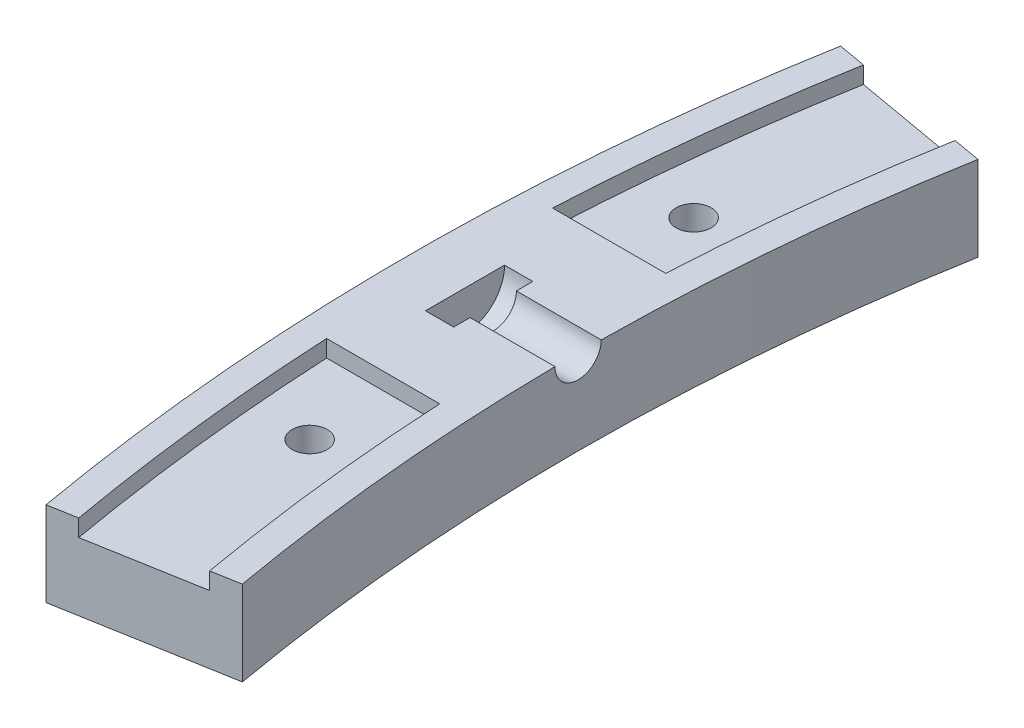
ISO-10303-21;
HEADER;
FILE_DESCRIPTION(('STEP AP214'),'2;1');
FILE_NAME('part.step','',(''),(''),'','','');
FILE_SCHEMA(('AUTOMOTIVE_DESIGN { 1 0 10303 214 1 1 1 1 }'));
ENDSEC;
DATA;
#1=APPLICATION_CONTEXT('core data for automotive mechanical design processes');
#2=APPLICATION_PROTOCOL_DEFINITION('international standard','automotive_design',2000,#1);
#3=PRODUCT_CONTEXT('',#1,'mechanical');
#4=PRODUCT('Part','Part','',(#3));
#5=PRODUCT_RELATED_PRODUCT_CATEGORY('part','',(#4));
#6=PRODUCT_DEFINITION_FORMATION('','',#4);
#7=PRODUCT_DEFINITION_CONTEXT('part definition',#1,'design');
#8=PRODUCT_DEFINITION('design','',#6,#7);
#9=PRODUCT_DEFINITION_SHAPE('','',#8);
#10=(LENGTH_UNIT() NAMED_UNIT(*) SI_UNIT(.MILLI.,.METRE.));
#11=(NAMED_UNIT(*) PLANE_ANGLE_UNIT() SI_UNIT($,.RADIAN.));
#12=(NAMED_UNIT(*) SI_UNIT($,.STERADIAN.) SOLID_ANGLE_UNIT());
#13=UNCERTAINTY_MEASURE_WITH_UNIT(LENGTH_MEASURE(1.E-05),#10,'distance_accuracy_value','');
#14=(GEOMETRIC_REPRESENTATION_CONTEXT(3) GLOBAL_UNCERTAINTY_ASSIGNED_CONTEXT((#13)) GLOBAL_UNIT_ASSIGNED_CONTEXT((#10,
#11,#12)) REPRESENTATION_CONTEXT('',''));
#15=CARTESIAN_POINT('',(0.,0.,0.));
#16=DIRECTION('',(0.,0.,1.));
#17=DIRECTION('',(1.,0.,0.));
#18=AXIS2_PLACEMENT_3D('',#15,#16,#17);
#19=CARTESIAN_POINT('',(0.,7.50000000000011,0.));
#20=DIRECTION('',(0.,1.00000000000001,0.));
#21=DIRECTION('',(0.,0.,1.00000000000005));
#22=AXIS2_PLACEMENT_3D('',#19,#20,#21);
#23=PLANE('',#22);
#24=DIRECTION('',(0.,0.,-1.00000000000005));
#25=VECTOR('',#24,1.);
#26=CARTESIAN_POINT('',(-195.000000000009,7.50000000000011,0.));
#27=LINE('',#26,#25);
#28=CARTESIAN_POINT('',(-195.000000000009,7.50000000000011,-2.05000000000012));
#29=VERTEX_POINT('',#28);
#30=CARTESIAN_POINT('',(-195.000000000009,7.50000000000011,-3.50000000000022));
#31=VERTEX_POINT('',#30);
#32=EDGE_CURVE('E160',#29,#31,#27,.T.);
#33=ORIENTED_EDGE('',*,*,#32,.F.);
#34=DIRECTION('',(-1.00000000000004,0.,0.));
#35=VECTOR('',#34,1.);
#36=CARTESIAN_POINT('',(-184.651453689793,7.50000000000011,-2.05000000000012));
#37=LINE('',#36,#35);
#38=CARTESIAN_POINT('',(-187.488792998413,7.50000000000011,-2.05000000000012));
#39=VERTEX_POINT('',#38);
#40=EDGE_CURVE('E48',#29,#39,#37,.F.);
#41=ORIENTED_EDGE('',*,*,#40,.T.);
#42=CARTESIAN_POINT('',(0.,7.50000000000011,0.));
#43=DIRECTION('',(0.,-1.00000000000001,0.));
#44=DIRECTION('',(0.,0.,1.00000000000005));
#45=AXIS2_PLACEMENT_3D('',#42,#43,#44);
#46=CIRCLE('',#45,187.5);
#47=CARTESIAN_POINT('',(-184.651453689793,7.50000000000011,-32.559033312551));
#48=VERTEX_POINT('',#47);
#49=EDGE_CURVE('E248',#39,#48,#46,.T.);
#50=ORIENTED_EDGE('',*,*,#49,.T.);
#51=DIRECTION('',(-0.984807753012244,0.,-0.173648177666936));
#52=VECTOR('',#51,1.);
#53=CARTESIAN_POINT('',(-199.423569984981,7.50000000000011,-35.1637559775549));
#54=LINE('',#53,#52);
#55=CARTESIAN_POINT('',(-187.113473072324,7.50000000000011,-32.9931537567183));
#56=VERTEX_POINT('',#55);
#57=EDGE_CURVE('E251',#48,#56,#54,.T.);
#58=ORIENTED_EDGE('',*,*,#57,.T.);
#59=CARTESIAN_POINT('',(0.,7.50000000000011,0.));
#60=DIRECTION('',(0.,1.00000000000001,0.));
#61=DIRECTION('',(0.,0.,1.00000000000005));
#62=AXIS2_PLACEMENT_3D('',#59,#60,#61);
#63=CIRCLE('',#62,190.);
#64=CARTESIAN_POINT('',(-189.736659610112,7.50000000000011,-10.0000000000003));
#65=VERTEX_POINT('',#64);
#66=EDGE_CURVE('E198',#56,#65,#63,.T.);
#67=ORIENTED_EDGE('',*,*,#66,.T.);
#68=DIRECTION('',(-1.00000000000004,0.,0.));
#69=VECTOR('',#68,1.);
#70=CARTESIAN_POINT('',(0.,7.50000000000011,-10.0000000000003));
#71=LINE('',#70,#69);
#72=CARTESIAN_POINT('',(-199.749843554391,7.50000000000011,-10.0000000000003));
#73=VERTEX_POINT('',#72);
#74=EDGE_CURVE('E189',#65,#73,#71,.T.);
#75=ORIENTED_EDGE('',*,*,#74,.T.);
#76=CARTESIAN_POINT('',(0.,7.50000000000011,0.));
#77=DIRECTION('',(0.,1.00000000000001,0.));
#78=DIRECTION('',(0.,0.,1.00000000000005));
#79=AXIS2_PLACEMENT_3D('',#76,#77,#78);
#80=CIRCLE('',#79,200.);
#81=CARTESIAN_POINT('',(-196.961550602451,7.50000000000011,-34.7296355333876));
#82=VERTEX_POINT('',#81);
#83=EDGE_CURVE('E201',#82,#73,#80,.T.);
#84=ORIENTED_EDGE('',*,*,#83,.F.);
#85=CARTESIAN_POINT('',(-199.423569984981,7.50000000000011,-35.1637559775549));
#86=VERTEX_POINT('',#85);
#87=EDGE_CURVE('E250',#82,#86,#54,.T.);
#88=ORIENTED_EDGE('',*,*,#87,.T.);
#89=CARTESIAN_POINT('',(0.,7.50000000000011,0.));
#90=DIRECTION('',(0.,1.00000000000001,0.));
#91=DIRECTION('',(0.,0.,1.00000000000005));
#92=AXIS2_PLACEMENT_3D('',#89,#90,#91);
#93=CIRCLE('',#92,202.5);
#94=CARTESIAN_POINT('',(-199.423569984981,7.50000000000011,35.163755977555));
#95=VERTEX_POINT('',#94);
#96=EDGE_CURVE('E240',#86,#95,#93,.T.);
#97=ORIENTED_EDGE('',*,*,#96,.T.);
#98=DIRECTION('',(0.984807753012244,0.,-0.173648177666936));
#99=VECTOR('',#98,1.);
#100=CARTESIAN_POINT('',(-184.651453689793,7.50000000000011,32.559033312551));
#101=LINE('',#100,#99);
#102=CARTESIAN_POINT('',(-196.961550602451,7.50000000000011,34.7296355333876));
#103=VERTEX_POINT('',#102);
#104=EDGE_CURVE('E245',#95,#103,#101,.T.);
#105=ORIENTED_EDGE('',*,*,#104,.T.);
#106=CARTESIAN_POINT('',(0.,7.50000000000011,0.));
#107=DIRECTION('',(0.,1.00000000000001,0.));
#108=DIRECTION('',(0.,0.,1.00000000000005));
#109=AXIS2_PLACEMENT_3D('',#106,#107,#108);
#110=CIRCLE('',#109,200.);
#111=CARTESIAN_POINT('',(-199.749843554391,7.50000000000011,10.0000000000004));
#112=VERTEX_POINT('',#111);
#113=EDGE_CURVE('E220',#112,#103,#110,.T.);
#114=ORIENTED_EDGE('',*,*,#113,.F.);
#115=DIRECTION('',(1.00000000000004,0.,0.));
#116=VECTOR('',#115,1.);
#117=CARTESIAN_POINT('',(0.,7.50000000000011,10.0000000000004));
#118=LINE('',#117,#116);
#119=CARTESIAN_POINT('',(-189.736659610112,7.50000000000011,10.0000000000004));
#120=VERTEX_POINT('',#119);
#121=EDGE_CURVE('E180',#112,#120,#118,.T.);
#122=ORIENTED_EDGE('',*,*,#121,.T.);
#123=CARTESIAN_POINT('',(0.,7.50000000000011,0.));
#124=DIRECTION('',(0.,1.00000000000001,0.));
#125=DIRECTION('',(0.,0.,1.00000000000005));
#126=AXIS2_PLACEMENT_3D('',#123,#124,#125);
#127=CIRCLE('',#126,190.);
#128=CARTESIAN_POINT('',(-187.113473072324,7.50000000000011,32.9931537567183));
#129=VERTEX_POINT('',#128);
#130=EDGE_CURVE('E177',#120,#129,#127,.T.);
#131=ORIENTED_EDGE('',*,*,#130,.T.);
#132=CARTESIAN_POINT('',(-184.651453689793,7.50000000000011,32.5590333125509));
#133=VERTEX_POINT('',#132);
#134=EDGE_CURVE('E243',#129,#133,#101,.T.);
#135=ORIENTED_EDGE('',*,*,#134,.T.);
#136=CARTESIAN_POINT('',(-187.488792998413,7.50000000000011,2.05000000000007));
#137=VERTEX_POINT('',#136);
#138=EDGE_CURVE('E155',#133,#137,#46,.T.);
#139=ORIENTED_EDGE('',*,*,#138,.T.);
#140=DIRECTION('',(-1.00000000000004,0.,0.));
#141=VECTOR('',#140,1.);
#142=CARTESIAN_POINT('',(-184.651453689793,7.50000000000011,2.05000000000007));
#143=LINE('',#142,#141);
#144=CARTESIAN_POINT('',(-195.000000000009,7.50000000000011,2.05000000000007));
#145=VERTEX_POINT('',#144);
#146=EDGE_CURVE('E146',#137,#145,#143,.T.);
#147=ORIENTED_EDGE('',*,*,#146,.T.);
#148=CARTESIAN_POINT('',(-195.000000000009,7.50000000000011,3.50000000000017));
#149=VERTEX_POINT('',#148);
#150=EDGE_CURVE('E153',#149,#145,#27,.T.);
#151=ORIENTED_EDGE('',*,*,#150,.F.);
#152=DIRECTION('',(1.00000000000004,0.,0.));
#153=VECTOR('',#152,1.);
#154=CARTESIAN_POINT('',(-197.500000000009,7.50000000000011,3.50000000000017));
#155=LINE('',#154,#153);
#156=CARTESIAN_POINT('',(-197.500000000009,7.50000000000011,3.50000000000017));
#157=VERTEX_POINT('',#156);
#158=EDGE_CURVE('E162',#157,#149,#155,.T.);
#159=ORIENTED_EDGE('',*,*,#158,.F.);
#160=DIRECTION('',(0.,0.,-1.00000000000005));
#161=VECTOR('',#160,1.);
#162=CARTESIAN_POINT('',(-197.500000000009,7.50000000000011,0.));
#163=LINE('',#162,#161);
#164=CARTESIAN_POINT('',(-197.500000000009,7.50000000000011,-3.50000000000022));
#165=VERTEX_POINT('',#164);
#166=EDGE_CURVE('E42',#157,#165,#163,.T.);
#167=ORIENTED_EDGE('',*,*,#166,.T.);
#168=DIRECTION('',(1.00000000000004,0.,0.));
#169=VECTOR('',#168,1.);
#170=CARTESIAN_POINT('',(-197.500000000009,7.50000000000011,-3.50000000000022));
#171=LINE('',#170,#169);
#172=EDGE_CURVE('E159',#31,#165,#171,.F.);
#173=ORIENTED_EDGE('',*,*,#172,.F.);
#174=EDGE_LOOP('',(#33,#41,#50,#58,#67,#75,#84,#88,#97,#105,#114,#122,#131,#135,#139,#147,#151,
#159,#167,#173));
#175=FACE_BOUND('',#174,.T.);
#176=ADVANCED_FACE('F34',(#175),#23,.T.);
#177=CARTESIAN_POINT('',(0.,7.50000000000011,0.));
#178=DIRECTION('',(0.,-1.00000000000001,0.));
#179=DIRECTION('',(0.,0.,-1.00000000000005));
#180=AXIS2_PLACEMENT_3D('',#177,#178,#179);
#181=CYLINDRICAL_SURFACE('',#180,187.5);
#182=CARTESIAN_POINT('',(-187.488792998413,7.50000000000011,2.05000000000007));
#183=CARTESIAN_POINT('',(-187.488792849281,7.44232711308553,2.04999961912121));
#184=CARTESIAN_POINT('',(-187.488819643224,7.38468185889424,2.0475646966342));
#185=CARTESIAN_POINT('',(-187.488925536575,7.26980385815491,2.03785081221489));
#186=CARTESIAN_POINT('',(-187.489004633468,7.2125710918987,2.03057208328557));
#187=CARTESIAN_POINT('',(-187.489317677698,7.04220079957593,2.00153837830414));
#188=CARTESIAN_POINT('',(-187.48962738847,6.93020459038204,1.97258569878913));
#189=CARTESIAN_POINT('',(-187.490414473226,6.71266806517123,1.89629080362172));
#190=CARTESIAN_POINT('',(-187.490891924796,6.60713076320279,1.84894007712929));
#191=CARTESIAN_POINT('',(-187.491960485973,6.40550870317435,1.73719964588891));
#192=CARTESIAN_POINT('',(-187.492551573346,6.30942210149567,1.67281327349101));
#193=CARTESIAN_POINT('',(-187.493780888756,6.12941929865537,1.52882171925991));
#194=CARTESIAN_POINT('',(-187.494419119586,6.04550381930664,1.44921563546462));
#195=CARTESIAN_POINT('',(-187.495670842949,5.89221433312215,1.27703268155445));
#196=CARTESIAN_POINT('',(-187.4962843317,5.82284254272342,1.18445383799145));
#197=CARTESIAN_POINT('',(-187.497417285369,5.70062866199897,0.988964560660456));
#198=CARTESIAN_POINT('',(-187.497936752081,5.647786256115,0.886054324176002));
#199=CARTESIAN_POINT('',(-187.498823077717,5.5601321464015,0.672828980658536));
#200=CARTESIAN_POINT('',(-187.49918994644,5.52531928471737,0.562514349648704));
#201=CARTESIAN_POINT('',(-187.499729758185,5.47470826179882,0.337608070566619));
#202=CARTESIAN_POINT('',(-187.499902705095,5.45890971928417,0.223016508304045));
#203=CARTESIAN_POINT('',(-187.500035189832,5.44677456272366,-0.00719528273405206));
#204=CARTESIAN_POINT('',(-187.499994722813,5.45043839059384,-0.122815534807681));
#205=CARTESIAN_POINT('',(-187.499704938695,5.47712422933031,-0.351793552120607));
#206=CARTESIAN_POINT('',(-187.4994556326,5.50014522032995,-0.465151436234678));
#207=CARTESIAN_POINT('',(-187.498776290712,5.56489028065436,-0.686392914402732));
#208=CARTESIAN_POINT('',(-187.498346255467,5.60661429331914,-0.794276525039689));
#209=CARTESIAN_POINT('',(-187.497353907621,5.70758310800407,-1.00151277318807));
#210=CARTESIAN_POINT('',(-187.496791588681,5.7668287497668,-1.10086500152945));
#211=CARTESIAN_POINT('',(-187.495598106194,5.90115548445373,-1.2882082364995));
#212=CARTESIAN_POINT('',(-187.494966946011,5.97623580382809,-1.37619979777689));
#213=CARTESIAN_POINT('',(-187.493706954425,6.14009403418969,-1.53832355892678));
#214=CARTESIAN_POINT('',(-187.493078122837,6.22887082269646,-1.61245689343629));
#215=CARTESIAN_POINT('',(-187.491893425822,6.41764509266345,-1.74479088744738));
#216=CARTESIAN_POINT('',(-187.491337583642,6.51764613007164,-1.80298647752054));
#217=CARTESIAN_POINT('',(-187.490361477193,6.72604223808001,-1.90179009729814));
#218=CARTESIAN_POINT('',(-187.489941295683,6.8344423826509,-1.94238739653085));
#219=CARTESIAN_POINT('',(-187.489284996913,7.05643589799864,-2.00474436125492));
#220=CARTESIAN_POINT('',(-187.489048598591,7.17002105647758,-2.02653279700965));
#221=CARTESIAN_POINT('',(-187.488875643458,7.32030107272998,-2.04242845263005));
#222=CARTESIAN_POINT('',(-187.488844667317,7.35621372009782,-2.04526928209854));
#223=CARTESIAN_POINT('',(-187.488803372466,7.42807939690246,-2.04905246362838));
#224=CARTESIAN_POINT('',(-187.488793019685,7.4640322613972,-2.04999794685185));
#225=CARTESIAN_POINT('',(-187.488792998413,7.50000000000011,-2.05000000000012));
#226=B_SPLINE_CURVE_WITH_KNOTS('',3,(#182,#183,#184,#185,#186,#187,#188,#189,#190,#191,#192,
#193,#194,#195,#196,#197,#198,#199,#200,#201,#202,#203,#204,#205,#206,#207,#208,#209,#210,#211,
#212,#213,#214,#215,#216,#217,#218,#219,#220,#221,#222,#223,#224,#225),.UNSPECIFIED.,.F.,.F.,(4,
2,2,2,2,2,2,2,2,2,2,2,2,2,2,2,2,2,2,2,2,4),(0.,0.172912382791425,0.345816448531269,
0.6910716400783,1.03648673538197,1.38183431377899,1.72720236477407,2.0726230111579,
2.41803706280208,2.76342892925654,3.10881386970529,3.45420665255967,3.79958123891978,
4.14495477898958,4.49034487413383,4.83571810031493,5.18106303679866,5.52651769228723,
5.87218269178337,6.21731801628906,6.32535769525366,6.4332187422346),.UNSPECIFIED.);
#227=EDGE_CURVE('E156',#137,#39,#226,.T.);
#228=ORIENTED_EDGE('',*,*,#227,.F.);
#229=ORIENTED_EDGE('',*,*,#138,.F.);
#230=DIRECTION('',(0.,-1.00000000000001,0.));
#231=VECTOR('',#230,1.);
#232=CARTESIAN_POINT('',(-184.651453689793,7.50000000000011,32.5590333125509));
#233=LINE('',#232,#231);
#234=CARTESIAN_POINT('',(-184.651453689793,0.,32.5590333125509));
#235=VERTEX_POINT('',#234);
#236=EDGE_CURVE('E266',#133,#235,#233,.T.);
#237=ORIENTED_EDGE('',*,*,#236,.T.);
#238=CARTESIAN_POINT('',(0.,0.,0.));
#239=DIRECTION('',(0.,-1.00000000000001,0.));
#240=DIRECTION('',(0.,0.,1.00000000000005));
#241=AXIS2_PLACEMENT_3D('',#238,#239,#240);
#242=CIRCLE('',#241,187.5);
#243=CARTESIAN_POINT('',(-184.651453689793,0.,-32.559033312551));
#244=VERTEX_POINT('',#243);
#245=EDGE_CURVE('E259',#235,#244,#242,.T.);
#246=ORIENTED_EDGE('',*,*,#245,.T.);
#247=DIRECTION('',(0.,-1.00000000000001,0.));
#248=VECTOR('',#247,1.);
#249=CARTESIAN_POINT('',(-184.651453689793,7.50000000000011,-32.559033312551));
#250=LINE('',#249,#248);
#251=EDGE_CURVE('E264',#48,#244,#250,.T.);
#252=ORIENTED_EDGE('',*,*,#251,.F.);
#253=ORIENTED_EDGE('',*,*,#49,.F.);
#254=EDGE_LOOP('',(#228,#229,#237,#246,#252,#253));
#255=FACE_BOUND('',#254,.T.);
#256=ADVANCED_FACE('F284',(#255),#181,.F.);
#257=CARTESIAN_POINT('',(-184.651453689793,7.50000000000011,32.559033312551));
#258=DIRECTION('',(-0.173648177666934,0.,-0.984807753012258));
#259=DIRECTION('',(-0.984807753012244,0.,0.173648177666936));
#260=AXIS2_PLACEMENT_3D('',#257,#258,#259);
#261=PLANE('',#260);
#262=DIRECTION('',(0.,1.00000000000001,0.));
#263=VECTOR('',#262,1.);
#264=CARTESIAN_POINT('',(-187.113473072324,6.00000000000011,32.9931537567183));
#265=LINE('',#264,#263);
#266=CARTESIAN_POINT('',(-187.113473072324,6.00000000000011,32.9931537567183));
#267=VERTEX_POINT('',#266);
#268=EDGE_CURVE('E202',#267,#129,#265,.T.);
#269=ORIENTED_EDGE('',*,*,#268,.F.);
#270=DIRECTION('',(0.984807753012244,0.,-0.173648177666936));
#271=VECTOR('',#270,1.);
#272=CARTESIAN_POINT('',(0.,6.00000000000011,0.));
#273=LINE('',#272,#271);
#274=CARTESIAN_POINT('',(-196.961550602451,6.00000000000011,34.7296355333876));
#275=VERTEX_POINT('',#274);
#276=EDGE_CURVE('E225',#275,#267,#273,.T.);
#277=ORIENTED_EDGE('',*,*,#276,.F.);
#278=DIRECTION('',(0.,1.00000000000001,0.));
#279=VECTOR('',#278,1.);
#280=CARTESIAN_POINT('',(-196.961550602451,6.00000000000011,34.7296355333876));
#281=LINE('',#280,#279);
#282=EDGE_CURVE('E233',#275,#103,#281,.T.);
#283=ORIENTED_EDGE('',*,*,#282,.T.);
#284=ORIENTED_EDGE('',*,*,#104,.F.);
#285=DIRECTION('',(0.,-1.00000000000001,0.));
#286=VECTOR('',#285,1.);
#287=CARTESIAN_POINT('',(-199.423569984981,7.50000000000011,35.163755977555));
#288=LINE('',#287,#286);
#289=CARTESIAN_POINT('',(-199.423569984981,0.,35.163755977555));
#290=VERTEX_POINT('',#289);
#291=EDGE_CURVE('E164',#95,#290,#288,.T.);
#292=ORIENTED_EDGE('',*,*,#291,.T.);
#293=DIRECTION('',(0.984807753012244,0.,-0.173648177666936));
#294=VECTOR('',#293,1.);
#295=CARTESIAN_POINT('',(-184.651453689793,0.,32.559033312551));
#296=LINE('',#295,#294);
#297=EDGE_CURVE('E257',#290,#235,#296,.T.);
#298=ORIENTED_EDGE('',*,*,#297,.T.);
#299=ORIENTED_EDGE('',*,*,#236,.F.);
#300=ORIENTED_EDGE('',*,*,#134,.F.);
#301=EDGE_LOOP('',(#269,#277,#283,#284,#292,#298,#299,#300));
#302=FACE_BOUND('',#301,.T.);
#303=ADVANCED_FACE('F275',(#302),#261,.F.);
#304=CARTESIAN_POINT('',(-199.423569984981,7.50000000000011,-35.1637559775549));
#305=DIRECTION('',(-0.173648177666934,0.,0.984807753012258));
#306=DIRECTION('',(0.984807753012244,0.,0.173648177666936));
#307=AXIS2_PLACEMENT_3D('',#304,#305,#306);
#308=PLANE('',#307);
#309=DIRECTION('',(0.,1.00000000000001,0.));
#310=VECTOR('',#309,1.);
#311=CARTESIAN_POINT('',(-187.113473072324,6.00000000000011,-32.9931537567183));
#312=LINE('',#311,#310);
#313=CARTESIAN_POINT('',(-187.113473072324,6.00000000000011,-32.9931537567183));
#314=VERTEX_POINT('',#313);
#315=EDGE_CURVE('E197',#314,#56,#312,.T.);
#316=ORIENTED_EDGE('',*,*,#315,.T.);
#317=ORIENTED_EDGE('',*,*,#57,.F.);
#318=ORIENTED_EDGE('',*,*,#251,.T.);
#319=DIRECTION('',(-0.984807753012244,0.,-0.173648177666936));
#320=VECTOR('',#319,1.);
#321=CARTESIAN_POINT('',(-199.423569984981,0.,-35.1637559775549));
#322=LINE('',#321,#320);
#323=CARTESIAN_POINT('',(-199.423569984981,0.,-35.1637559775549));
#324=VERTEX_POINT('',#323);
#325=EDGE_CURVE('E244',#244,#324,#322,.T.);
#326=ORIENTED_EDGE('',*,*,#325,.T.);
#327=DIRECTION('',(0.,-1.00000000000001,0.));
#328=VECTOR('',#327,1.);
#329=CARTESIAN_POINT('',(-199.423569984981,7.50000000000011,-35.1637559775549));
#330=LINE('',#329,#328);
#331=EDGE_CURVE('E254',#86,#324,#330,.T.);
#332=ORIENTED_EDGE('',*,*,#331,.F.);
#333=ORIENTED_EDGE('',*,*,#87,.F.);
#334=DIRECTION('',(0.,1.00000000000001,0.));
#335=VECTOR('',#334,1.);
#336=CARTESIAN_POINT('',(-196.961550602451,6.00000000000011,-34.7296355333876));
#337=LINE('',#336,#335);
#338=CARTESIAN_POINT('',(-196.961550602451,6.00000000000011,-34.7296355333876));
#339=VERTEX_POINT('',#338);
#340=EDGE_CURVE('E213',#339,#82,#337,.T.);
#341=ORIENTED_EDGE('',*,*,#340,.F.);
#342=DIRECTION('',(-0.984807753012244,0.,-0.173648177666936));
#343=VECTOR('',#342,1.);
#344=CARTESIAN_POINT('',(0.,6.00000000000011,0.));
#345=LINE('',#344,#343);
#346=EDGE_CURVE('E188',#314,#339,#345,.T.);
#347=ORIENTED_EDGE('',*,*,#346,.F.);
#348=EDGE_LOOP('',(#316,#317,#318,#326,#332,#333,#341,#347));
#349=FACE_BOUND('',#348,.T.);
#350=ADVANCED_FACE('F288',(#349),#308,.F.);
#351=CARTESIAN_POINT('',(0.,7.50000000000011,0.));
#352=DIRECTION('',(0.,-1.00000000000001,0.));
#353=DIRECTION('',(0.,0.,-1.00000000000005));
#354=AXIS2_PLACEMENT_3D('',#351,#352,#353);
#355=CYLINDRICAL_SURFACE('',#354,202.5);
#356=CARTESIAN_POINT('',(0.,0.,0.));
#357=DIRECTION('',(0.,1.00000000000001,0.));
#358=DIRECTION('',(0.,0.,1.00000000000005));
#359=AXIS2_PLACEMENT_3D('',#356,#357,#358);
#360=CIRCLE('',#359,202.5);
#361=EDGE_CURVE('E210',#324,#290,#360,.T.);
#362=ORIENTED_EDGE('',*,*,#361,.T.);
#363=ORIENTED_EDGE('',*,*,#291,.F.);
#364=ORIENTED_EDGE('',*,*,#96,.F.);
#365=ORIENTED_EDGE('',*,*,#331,.T.);
#366=EDGE_LOOP('',(#362,#363,#364,#365));
#367=FACE_BOUND('',#366,.T.);
#368=ADVANCED_FACE('F36',(#367),#355,.T.);
#369=CARTESIAN_POINT('',(0.,0.,0.));
#370=DIRECTION('',(0.,1.00000000000001,0.));
#371=DIRECTION('',(0.,0.,1.00000000000005));
#372=AXIS2_PLACEMENT_3D('',#369,#370,#371);
#373=PLANE('',#372);
#374=CARTESIAN_POINT('',(-194.257966127898,0.,16.995369835794));
#375=DIRECTION('',(0.,-1.00000000000001,0.));
#376=DIRECTION('',(0.,0.,-1.00000000000004));
#377=AXIS2_PLACEMENT_3D('',#374,#375,#376);
#378=CIRCLE('',#377,1.55);
#379=CARTESIAN_POINT('',(-194.257966127898,0.,15.445369835794));
#380=VERTEX_POINT('',#379);
#381=EDGE_CURVE('E487',#380,#380,#378,.T.);
#382=ORIENTED_EDGE('',*,*,#381,.F.);
#383=EDGE_LOOP('',(#382));
#384=FACE_BOUND('',#383,.T.);
#385=CARTESIAN_POINT('',(-194.257966127898,0.,-16.995369835794));
#386=DIRECTION('',(0.,-1.00000000000001,0.));
#387=DIRECTION('',(0.,0.,-1.00000000000004));
#388=AXIS2_PLACEMENT_3D('',#385,#386,#387);
#389=CIRCLE('',#388,1.55);
#390=CARTESIAN_POINT('',(-194.257966127898,0.,-18.5453698357941));
#391=VERTEX_POINT('',#390);
#392=EDGE_CURVE('E293',#391,#391,#389,.T.);
#393=ORIENTED_EDGE('',*,*,#392,.F.);
#394=EDGE_LOOP('',(#393));
#395=FACE_BOUND('',#394,.T.);
#396=ORIENTED_EDGE('',*,*,#361,.F.);
#397=ORIENTED_EDGE('',*,*,#325,.F.);
#398=ORIENTED_EDGE('',*,*,#245,.F.);
#399=ORIENTED_EDGE('',*,*,#297,.F.);
#400=EDGE_LOOP('',(#396,#397,#398,#399));
#401=FACE_BOUND('',#400,.T.);
#402=ADVANCED_FACE('F282',(#384,#395,#401),#373,.F.);
#403=CARTESIAN_POINT('',(0.,6.00000000000011,0.));
#404=DIRECTION('',(0.,1.00000000000001,0.));
#405=DIRECTION('',(0.,0.,1.00000000000005));
#406=AXIS2_PLACEMENT_3D('',#403,#404,#405);
#407=CYLINDRICAL_SURFACE('',#406,190.);
#408=ORIENTED_EDGE('',*,*,#130,.F.);
#409=DIRECTION('',(0.,1.00000000000001,0.));
#410=VECTOR('',#409,1.);
#411=CARTESIAN_POINT('',(-189.736659610112,6.00000000000011,10.0000000000004));
#412=LINE('',#411,#410);
#413=CARTESIAN_POINT('',(-189.736659610112,6.00000000000011,10.0000000000004));
#414=VERTEX_POINT('',#413);
#415=EDGE_CURVE('E227',#414,#120,#412,.T.);
#416=ORIENTED_EDGE('',*,*,#415,.F.);
#417=CARTESIAN_POINT('',(0.,6.00000000000011,0.));
#418=DIRECTION('',(0.,1.00000000000001,0.));
#419=DIRECTION('',(0.,0.,1.00000000000005));
#420=AXIS2_PLACEMENT_3D('',#417,#418,#419);
#421=CIRCLE('',#420,190.);
#422=EDGE_CURVE('E217',#414,#267,#421,.T.);
#423=ORIENTED_EDGE('',*,*,#422,.T.);
#424=ORIENTED_EDGE('',*,*,#268,.T.);
#425=EDGE_LOOP('',(#408,#416,#423,#424));
#426=FACE_BOUND('',#425,.T.);
#427=ADVANCED_FACE('F340',(#426),#407,.T.);
#428=CARTESIAN_POINT('',(0.,6.00000000000011,0.));
#429=DIRECTION('',(0.,1.00000000000001,0.));
#430=DIRECTION('',(0.,0.,1.00000000000005));
#431=AXIS2_PLACEMENT_3D('',#428,#429,#430);
#432=CYLINDRICAL_SURFACE('',#431,200.);
#433=ORIENTED_EDGE('',*,*,#113,.T.);
#434=ORIENTED_EDGE('',*,*,#282,.F.);
#435=CARTESIAN_POINT('',(0.,6.00000000000011,0.));
#436=DIRECTION('',(0.,1.00000000000001,0.));
#437=DIRECTION('',(0.,0.,1.00000000000005));
#438=AXIS2_PLACEMENT_3D('',#435,#436,#437);
#439=CIRCLE('',#438,200.);
#440=CARTESIAN_POINT('',(-199.749843554391,6.00000000000011,10.0000000000004));
#441=VERTEX_POINT('',#440);
#442=EDGE_CURVE('E222',#441,#275,#439,.T.);
#443=ORIENTED_EDGE('',*,*,#442,.F.);
#444=DIRECTION('',(0.,1.00000000000001,0.));
#445=VECTOR('',#444,1.);
#446=CARTESIAN_POINT('',(-199.749843554391,6.00000000000011,10.0000000000004));
#447=LINE('',#446,#445);
#448=EDGE_CURVE('E236',#441,#112,#447,.T.);
#449=ORIENTED_EDGE('',*,*,#448,.T.);
#450=EDGE_LOOP('',(#433,#434,#443,#449));
#451=FACE_BOUND('',#450,.T.);
#452=ADVANCED_FACE('F337',(#451),#432,.F.);
#453=CARTESIAN_POINT('',(0.,6.00000000000011,10.0000000000004));
#454=DIRECTION('',(0.,0.,1.00000000000005));
#455=DIRECTION('',(1.00000000000004,0.,0.));
#456=AXIS2_PLACEMENT_3D('',#453,#454,#455);
#457=PLANE('',#456);
#458=ORIENTED_EDGE('',*,*,#121,.F.);
#459=ORIENTED_EDGE('',*,*,#448,.F.);
#460=DIRECTION('',(1.00000000000004,0.,0.));
#461=VECTOR('',#460,1.);
#462=CARTESIAN_POINT('',(0.,6.00000000000011,10.0000000000004));
#463=LINE('',#462,#461);
#464=EDGE_CURVE('E219',#441,#414,#463,.T.);
#465=ORIENTED_EDGE('',*,*,#464,.T.);
#466=ORIENTED_EDGE('',*,*,#415,.T.);
#467=EDGE_LOOP('',(#458,#459,#465,#466));
#468=FACE_BOUND('',#467,.T.);
#469=ADVANCED_FACE('F335',(#468),#457,.T.);
#470=CARTESIAN_POINT('',(0.,6.00000000000011,0.));
#471=DIRECTION('',(0.,1.00000000000001,0.));
#472=DIRECTION('',(0.,0.,1.00000000000005));
#473=AXIS2_PLACEMENT_3D('',#470,#471,#472);
#474=PLANE('',#473);
#475=CARTESIAN_POINT('',(-194.257966127898,6.00000000000011,16.995369835794));
#476=DIRECTION('',(0.,1.00000000000001,0.));
#477=DIRECTION('',(0.,0.,1.00000000000004));
#478=AXIS2_PLACEMENT_3D('',#475,#476,#477);
#479=CIRCLE('',#478,1.55);
#480=CARTESIAN_POINT('',(-194.257966127898,6.00000000000011,18.5453698357941));
#481=VERTEX_POINT('',#480);
#482=EDGE_CURVE('E484',#481,#481,#479,.T.);
#483=ORIENTED_EDGE('',*,*,#482,.F.);
#484=EDGE_LOOP('',(#483));
#485=FACE_BOUND('',#484,.T.);
#486=ORIENTED_EDGE('',*,*,#422,.F.);
#487=ORIENTED_EDGE('',*,*,#464,.F.);
#488=ORIENTED_EDGE('',*,*,#442,.T.);
#489=ORIENTED_EDGE('',*,*,#276,.T.);
#490=EDGE_LOOP('',(#486,#487,#488,#489));
#491=FACE_BOUND('',#490,.T.);
#492=ADVANCED_FACE('F331',(#485,#491),#474,.T.);
#493=CARTESIAN_POINT('',(0.,6.00000000000011,0.));
#494=DIRECTION('',(0.,1.00000000000001,0.));
#495=DIRECTION('',(0.,0.,1.00000000000005));
#496=AXIS2_PLACEMENT_3D('',#493,#494,#495);
#497=CYLINDRICAL_SURFACE('',#496,190.);
#498=ORIENTED_EDGE('',*,*,#66,.F.);
#499=ORIENTED_EDGE('',*,*,#315,.F.);
#500=CARTESIAN_POINT('',(0.,6.00000000000011,0.));
#501=DIRECTION('',(0.,1.00000000000001,0.));
#502=DIRECTION('',(0.,0.,1.00000000000005));
#503=AXIS2_PLACEMENT_3D('',#500,#501,#502);
#504=CIRCLE('',#503,190.);
#505=CARTESIAN_POINT('',(-189.736659610112,6.00000000000011,-10.0000000000003));
#506=VERTEX_POINT('',#505);
#507=EDGE_CURVE('E185',#314,#506,#504,.T.);
#508=ORIENTED_EDGE('',*,*,#507,.T.);
#509=DIRECTION('',(0.,1.00000000000001,0.));
#510=VECTOR('',#509,1.);
#511=CARTESIAN_POINT('',(-189.736659610112,6.00000000000011,-10.0000000000003));
#512=LINE('',#511,#510);
#513=EDGE_CURVE('E207',#506,#65,#512,.T.);
#514=ORIENTED_EDGE('',*,*,#513,.T.);
#515=EDGE_LOOP('',(#498,#499,#508,#514));
#516=FACE_BOUND('',#515,.T.);
#517=ADVANCED_FACE('F324',(#516),#497,.T.);
#518=CARTESIAN_POINT('',(0.,6.00000000000011,-10.0000000000003));
#519=DIRECTION('',(0.,0.,-1.00000000000005));
#520=DIRECTION('',(-1.00000000000004,0.,0.));
#521=AXIS2_PLACEMENT_3D('',#518,#519,#520);
#522=PLANE('',#521);
#523=ORIENTED_EDGE('',*,*,#74,.F.);
#524=ORIENTED_EDGE('',*,*,#513,.F.);
#525=DIRECTION('',(-1.00000000000004,0.,0.));
#526=VECTOR('',#525,1.);
#527=CARTESIAN_POINT('',(0.,6.00000000000011,-10.0000000000003));
#528=LINE('',#527,#526);
#529=CARTESIAN_POINT('',(-199.749843554391,6.00000000000011,-10.0000000000003));
#530=VERTEX_POINT('',#529);
#531=EDGE_CURVE('E195',#506,#530,#528,.T.);
#532=ORIENTED_EDGE('',*,*,#531,.T.);
#533=DIRECTION('',(0.,1.00000000000001,0.));
#534=VECTOR('',#533,1.);
#535=CARTESIAN_POINT('',(-199.749843554391,6.00000000000011,-10.0000000000003));
#536=LINE('',#535,#534);
#537=EDGE_CURVE('E211',#530,#73,#536,.T.);
#538=ORIENTED_EDGE('',*,*,#537,.T.);
#539=EDGE_LOOP('',(#523,#524,#532,#538));
#540=FACE_BOUND('',#539,.T.);
#541=ADVANCED_FACE('F321',(#540),#522,.T.);
#542=CARTESIAN_POINT('',(0.,6.00000000000011,0.));
#543=DIRECTION('',(0.,1.00000000000001,0.));
#544=DIRECTION('',(0.,0.,1.00000000000005));
#545=AXIS2_PLACEMENT_3D('',#542,#543,#544);
#546=CYLINDRICAL_SURFACE('',#545,200.);
#547=ORIENTED_EDGE('',*,*,#83,.T.);
#548=ORIENTED_EDGE('',*,*,#537,.F.);
#549=CARTESIAN_POINT('',(0.,6.00000000000011,0.));
#550=DIRECTION('',(0.,1.00000000000001,0.));
#551=DIRECTION('',(0.,0.,1.00000000000005));
#552=AXIS2_PLACEMENT_3D('',#549,#550,#551);
#553=CIRCLE('',#552,200.);
#554=EDGE_CURVE('E192',#339,#530,#553,.T.);
#555=ORIENTED_EDGE('',*,*,#554,.F.);
#556=ORIENTED_EDGE('',*,*,#340,.T.);
#557=EDGE_LOOP('',(#547,#548,#555,#556));
#558=FACE_BOUND('',#557,.T.);
#559=ADVANCED_FACE('F319',(#558),#546,.F.);
#560=CARTESIAN_POINT('',(0.,6.00000000000011,0.));
#561=DIRECTION('',(0.,1.00000000000001,0.));
#562=DIRECTION('',(0.,0.,1.00000000000005));
#563=AXIS2_PLACEMENT_3D('',#560,#561,#562);
#564=PLANE('',#563);
#565=CARTESIAN_POINT('',(-194.257966127898,6.00000000000011,-16.995369835794));
#566=DIRECTION('',(0.,1.00000000000001,0.));
#567=DIRECTION('',(0.,0.,1.00000000000004));
#568=AXIS2_PLACEMENT_3D('',#565,#566,#567);
#569=CIRCLE('',#568,1.55);
#570=CARTESIAN_POINT('',(-194.257966127898,6.00000000000011,-15.445369835794));
#571=VERTEX_POINT('',#570);
#572=EDGE_CURVE('E290',#571,#571,#569,.T.);
#573=ORIENTED_EDGE('',*,*,#572,.F.);
#574=EDGE_LOOP('',(#573));
#575=FACE_BOUND('',#574,.T.);
#576=ORIENTED_EDGE('',*,*,#507,.F.);
#577=ORIENTED_EDGE('',*,*,#346,.T.);
#578=ORIENTED_EDGE('',*,*,#554,.T.);
#579=ORIENTED_EDGE('',*,*,#531,.F.);
#580=EDGE_LOOP('',(#576,#577,#578,#579));
#581=FACE_BOUND('',#580,.T.);
#582=ADVANCED_FACE('F316',(#575,#581),#564,.T.);
#583=CARTESIAN_POINT('',(-197.500000000009,7.50000000000011,0.));
#584=DIRECTION('',(1.00000000000004,0.,0.));
#585=DIRECTION('',(0.,0.,-1.00000000000005));
#586=AXIS2_PLACEMENT_3D('',#583,#584,#585);
#587=CYLINDRICAL_SURFACE('',#586,3.5);
#588=ORIENTED_EDGE('',*,*,#158,.T.);
#589=CARTESIAN_POINT('',(-195.000000000009,7.50000000000011,0.));
#590=DIRECTION('',(1.00000000000004,0.,0.));
#591=DIRECTION('',(0.,0.,-1.00000000000005));
#592=AXIS2_PLACEMENT_3D('',#589,#590,#591);
#593=CIRCLE('',#592,3.5);
#594=EDGE_CURVE('E56',#149,#31,#593,.T.);
#595=ORIENTED_EDGE('',*,*,#594,.T.);
#596=ORIENTED_EDGE('',*,*,#172,.T.);
#597=CARTESIAN_POINT('',(-197.500000000009,7.50000000000011,0.));
#598=DIRECTION('',(1.00000000000004,0.,0.));
#599=DIRECTION('',(0.,0.,-1.00000000000005));
#600=AXIS2_PLACEMENT_3D('',#597,#598,#599);
#601=CIRCLE('',#600,3.5);
#602=EDGE_CURVE('E174',#157,#165,#601,.T.);
#603=ORIENTED_EDGE('',*,*,#602,.F.);
#604=EDGE_LOOP('',(#588,#595,#596,#603));
#605=FACE_BOUND('',#604,.T.);
#606=ADVANCED_FACE('F176',(#605),#587,.F.);
#607=CARTESIAN_POINT('',(-197.500000000009,7.50000000000011,0.));
#608=DIRECTION('',(1.00000000000004,0.,0.));
#609=DIRECTION('',(0.,0.,-1.00000000000005));
#610=AXIS2_PLACEMENT_3D('',#607,#608,#609);
#611=PLANE('',#610);
#612=ORIENTED_EDGE('',*,*,#602,.T.);
#613=ORIENTED_EDGE('',*,*,#166,.F.);
#614=EDGE_LOOP('',(#612,#613));
#615=FACE_BOUND('',#614,.T.);
#616=ADVANCED_FACE('F173',(#615),#611,.T.);
#617=CARTESIAN_POINT('',(-195.000000000009,7.50000000000011,0.));
#618=DIRECTION('',(1.00000000000004,0.,0.));
#619=DIRECTION('',(0.,0.,-1.00000000000005));
#620=AXIS2_PLACEMENT_3D('',#617,#618,#619);
#621=PLANE('',#620);
#622=CARTESIAN_POINT('',(-195.000000000009,7.50000000000011,0.));
#623=DIRECTION('',(1.00000000000004,0.,0.));
#624=DIRECTION('',(0.,0.,-1.00000000000005));
#625=AXIS2_PLACEMENT_3D('',#622,#623,#624);
#626=CIRCLE('',#625,2.05);
#627=EDGE_CURVE('E11',#29,#145,#626,.F.);
#628=ORIENTED_EDGE('',*,*,#627,.F.);
#629=ORIENTED_EDGE('',*,*,#32,.T.);
#630=ORIENTED_EDGE('',*,*,#594,.F.);
#631=ORIENTED_EDGE('',*,*,#150,.T.);
#632=EDGE_LOOP('',(#628,#629,#630,#631));
#633=FACE_BOUND('',#632,.T.);
#634=ADVANCED_FACE('F158',(#633),#621,.F.);
#635=CARTESIAN_POINT('',(-184.651453689793,7.50000000000011,0.));
#636=DIRECTION('',(-1.00000000000004,0.,0.));
#637=DIRECTION('',(0.,0.,1.00000000000005));
#638=AXIS2_PLACEMENT_3D('',#635,#636,#637);
#639=CYLINDRICAL_SURFACE('',#638,2.05);
#640=ORIENTED_EDGE('',*,*,#627,.T.);
#641=ORIENTED_EDGE('',*,*,#146,.F.);
#642=ORIENTED_EDGE('',*,*,#227,.T.);
#643=ORIENTED_EDGE('',*,*,#40,.F.);
#644=EDGE_LOOP('',(#640,#641,#642,#643));
#645=FACE_BOUND('',#644,.T.);
#646=ADVANCED_FACE('F145',(#645),#639,.F.);
#647=CARTESIAN_POINT('',(-194.257966127898,0.,-16.995369835794));
#648=DIRECTION('',(0.,-1.00000000000001,0.));
#649=DIRECTION('',(0.,0.,-1.00000000000004));
#650=AXIS2_PLACEMENT_3D('',#647,#648,#649);
#651=CYLINDRICAL_SURFACE('',#650,1.55);
#652=ORIENTED_EDGE('',*,*,#572,.T.);
#653=EDGE_LOOP('',(#652));
#654=FACE_BOUND('',#653,.T.);
#655=ORIENTED_EDGE('',*,*,#392,.T.);
#656=EDGE_LOOP('',(#655));
#657=FACE_BOUND('',#656,.T.);
#658=ADVANCED_FACE('F308',(#654,#657),#651,.F.);
#659=CARTESIAN_POINT('',(-194.257966127898,0.,16.995369835794));
#660=DIRECTION('',(0.,-1.00000000000001,0.));
#661=DIRECTION('',(0.,0.,-1.00000000000004));
#662=AXIS2_PLACEMENT_3D('',#659,#660,#661);
#663=CYLINDRICAL_SURFACE('',#662,1.55);
#664=ORIENTED_EDGE('',*,*,#482,.T.);
#665=EDGE_LOOP('',(#664));
#666=FACE_BOUND('',#665,.T.);
#667=ORIENTED_EDGE('',*,*,#381,.T.);
#668=EDGE_LOOP('',(#667));
#669=FACE_BOUND('',#668,.T.);
#670=ADVANCED_FACE('F385',(#666,#669),#663,.F.);
#671=CLOSED_SHELL('',(#176,#256,#303,#350,#368,#402,#427,#452,#469,#492,#517,#541,#559,#582,
#606,#616,#634,#646,#658,#670));
#672=MANIFOLD_SOLID_BREP('B2',#671);
#673=ADVANCED_BREP_SHAPE_REPRESENTATION('',(#18,#672),#14);
#674=SHAPE_DEFINITION_REPRESENTATION(#9,#673);
ENDSEC;
END-ISO-10303-21;
